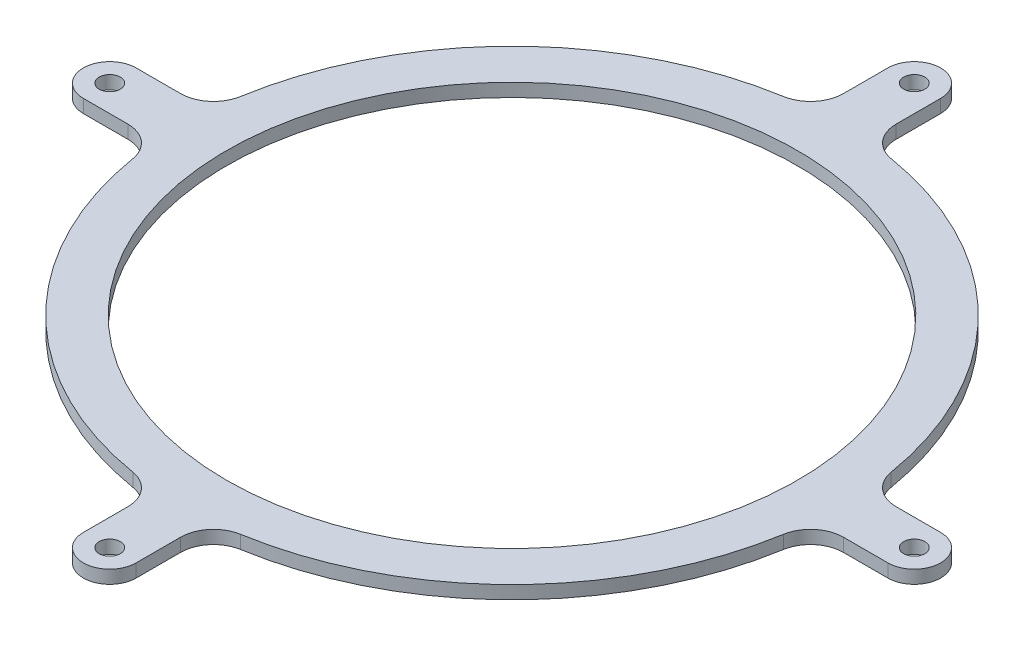
ISO-10303-21;
HEADER;
FILE_DESCRIPTION(('STEP AP214'),'2;1');
FILE_NAME('part.step','',(''),(''),'','','');
FILE_SCHEMA(('AUTOMOTIVE_DESIGN { 1 0 10303 214 1 1 1 1 }'));
ENDSEC;
DATA;
#1=APPLICATION_CONTEXT('core data for automotive mechanical design processes');
#2=APPLICATION_PROTOCOL_DEFINITION('international standard','automotive_design',2000,#1);
#3=PRODUCT_CONTEXT('',#1,'mechanical');
#4=PRODUCT('Part','Part','',(#3));
#5=PRODUCT_RELATED_PRODUCT_CATEGORY('part','',(#4));
#6=PRODUCT_DEFINITION_FORMATION('','',#4);
#7=PRODUCT_DEFINITION_CONTEXT('part definition',#1,'design');
#8=PRODUCT_DEFINITION('design','',#6,#7);
#9=PRODUCT_DEFINITION_SHAPE('','',#8);
#10=(LENGTH_UNIT() NAMED_UNIT(*) SI_UNIT(.MILLI.,.METRE.));
#11=(NAMED_UNIT(*) PLANE_ANGLE_UNIT() SI_UNIT($,.RADIAN.));
#12=(NAMED_UNIT(*) SI_UNIT($,.STERADIAN.) SOLID_ANGLE_UNIT());
#13=UNCERTAINTY_MEASURE_WITH_UNIT(LENGTH_MEASURE(1.E-05),#10,'distance_accuracy_value','');
#14=(GEOMETRIC_REPRESENTATION_CONTEXT(3) GLOBAL_UNCERTAINTY_ASSIGNED_CONTEXT((#13)) GLOBAL_UNIT_ASSIGNED_CONTEXT((#10,
#11,#12)) REPRESENTATION_CONTEXT('',''));
#15=CARTESIAN_POINT('',(0.,0.,0.));
#16=DIRECTION('',(0.,0.,1.));
#17=DIRECTION('',(1.,0.,0.));
#18=AXIS2_PLACEMENT_3D('',#15,#16,#17);
#19=CARTESIAN_POINT('',(0.,2.,0.));
#20=DIRECTION('',(0.,-1.,0.));
#21=DIRECTION('',(0.,0.,-1.));
#22=AXIS2_PLACEMENT_3D('',#19,#20,#21);
#23=CYLINDRICAL_SURFACE('',#22,50.);
#24=CARTESIAN_POINT('',(0.,2.,0.));
#25=DIRECTION('',(0.,1.,0.));
#26=DIRECTION('',(0.,0.,1.));
#27=AXIS2_PLACEMENT_3D('',#24,#25,#26);
#28=CIRCLE('',#27,50.);
#29=CARTESIAN_POINT('',(-8.18181818181824,2.,-49.326036240911));
#30=VERTEX_POINT('',#29);
#31=CARTESIAN_POINT('',(-49.326036240911,2.,-8.18181818181819));
#32=VERTEX_POINT('',#31);
#33=EDGE_CURVE('E368',#30,#32,#28,.T.);
#34=ORIENTED_EDGE('',*,*,#33,.F.);
#35=DIRECTION('',(0.,-1.,0.));
#36=VECTOR('',#35,1.);
#37=CARTESIAN_POINT('',(-8.18181818181824,2.,-49.326036240911));
#38=LINE('',#37,#36);
#39=CARTESIAN_POINT('',(-8.18181818181824,0.,-49.326036240911));
#40=VERTEX_POINT('',#39);
#41=EDGE_CURVE('E404',#30,#40,#38,.T.);
#42=ORIENTED_EDGE('',*,*,#41,.T.);
#43=CARTESIAN_POINT('',(0.,0.,0.));
#44=DIRECTION('',(0.,1.,0.));
#45=DIRECTION('',(0.,0.,1.));
#46=AXIS2_PLACEMENT_3D('',#43,#44,#45);
#47=CIRCLE('',#46,50.);
#48=CARTESIAN_POINT('',(-49.326036240911,0.,-8.18181818181819));
#49=VERTEX_POINT('',#48);
#50=EDGE_CURVE('E374',#40,#49,#47,.T.);
#51=ORIENTED_EDGE('',*,*,#50,.T.);
#52=DIRECTION('',(0.,-1.,0.));
#53=VECTOR('',#52,1.);
#54=CARTESIAN_POINT('',(-49.326036240911,2.,-8.18181818181819));
#55=LINE('',#54,#53);
#56=EDGE_CURVE('E400',#49,#32,#55,.F.);
#57=ORIENTED_EDGE('',*,*,#56,.T.);
#58=EDGE_LOOP('',(#34,#42,#51,#57));
#59=FACE_BOUND('',#58,.T.);
#60=ADVANCED_FACE('F39',(#59),#23,.T.);
#61=CARTESIAN_POINT('',(-49.326036240911,2.,8.18181818181818));
#62=VERTEX_POINT('',#61);
#63=CARTESIAN_POINT('',(-8.18181818181824,2.,49.326036240911));
#64=VERTEX_POINT('',#63);
#65=EDGE_CURVE('E364',#62,#64,#28,.T.);
#66=ORIENTED_EDGE('',*,*,#65,.F.);
#67=DIRECTION('',(0.,-1.,0.));
#68=VECTOR('',#67,1.);
#69=CARTESIAN_POINT('',(-49.326036240911,2.,8.18181818181818));
#70=LINE('',#69,#68);
#71=CARTESIAN_POINT('',(-49.326036240911,0.,8.18181818181818));
#72=VERTEX_POINT('',#71);
#73=EDGE_CURVE('E418',#62,#72,#70,.T.);
#74=ORIENTED_EDGE('',*,*,#73,.T.);
#75=CARTESIAN_POINT('',(-8.18181818181824,0.,49.326036240911));
#76=VERTEX_POINT('',#75);
#77=EDGE_CURVE('E370',#72,#76,#47,.T.);
#78=ORIENTED_EDGE('',*,*,#77,.T.);
#79=DIRECTION('',(0.,-1.,0.));
#80=VECTOR('',#79,1.);
#81=CARTESIAN_POINT('',(-8.18181818181824,2.,49.326036240911));
#82=LINE('',#81,#80);
#83=EDGE_CURVE('E414',#76,#64,#82,.F.);
#84=ORIENTED_EDGE('',*,*,#83,.T.);
#85=EDGE_LOOP('',(#66,#74,#78,#84));
#86=FACE_BOUND('',#85,.T.);
#87=ADVANCED_FACE('F556',(#86),#23,.T.);
#88=CARTESIAN_POINT('',(8.18181818181813,0.,49.3260362409111));
#89=VERTEX_POINT('',#88);
#90=CARTESIAN_POINT('',(49.326036240911,0.,8.18181818181818));
#91=VERTEX_POINT('',#90);
#92=EDGE_CURVE('E360',#89,#91,#47,.T.);
#93=ORIENTED_EDGE('',*,*,#92,.T.);
#94=DIRECTION('',(0.,-1.,0.));
#95=VECTOR('',#94,1.);
#96=CARTESIAN_POINT('',(49.326036240911,2.,8.18181818181818));
#97=LINE('',#96,#95);
#98=CARTESIAN_POINT('',(49.326036240911,2.,8.18181818181818));
#99=VERTEX_POINT('',#98);
#100=EDGE_CURVE('E379',#91,#99,#97,.F.);
#101=ORIENTED_EDGE('',*,*,#100,.T.);
#102=CARTESIAN_POINT('',(8.18181818181813,2.,49.3260362409111));
#103=VERTEX_POINT('',#102);
#104=EDGE_CURVE('E369',#103,#99,#28,.T.);
#105=ORIENTED_EDGE('',*,*,#104,.F.);
#106=DIRECTION('',(0.,-1.,0.));
#107=VECTOR('',#106,1.);
#108=CARTESIAN_POINT('',(8.18181818181813,2.,49.3260362409111));
#109=LINE('',#108,#107);
#110=EDGE_CURVE('E375',#103,#89,#109,.T.);
#111=ORIENTED_EDGE('',*,*,#110,.T.);
#112=EDGE_LOOP('',(#93,#101,#105,#111));
#113=FACE_BOUND('',#112,.T.);
#114=ADVANCED_FACE('F487',(#113),#23,.T.);
#115=CARTESIAN_POINT('',(0.,2.,0.));
#116=DIRECTION('',(0.,1.,0.));
#117=DIRECTION('',(0.,0.,1.));
#118=AXIS2_PLACEMENT_3D('',#115,#116,#117);
#119=PLANE('',#118);
#120=DIRECTION('',(0.,0.,1.));
#121=VECTOR('',#120,1.);
#122=CARTESIAN_POINT('',(-4.00000000000006,2.,-47.6833713481392));
#123=LINE('',#122,#121);
#124=CARTESIAN_POINT('',(-3.99999999999936,2.,-61.0000000000001));
#125=VERTEX_POINT('',#124);
#126=CARTESIAN_POINT('',(-4.00000000000006,2.,-54.2586398650021));
#127=VERTEX_POINT('',#126);
#128=EDGE_CURVE('E213',#125,#127,#123,.T.);
#129=ORIENTED_EDGE('',*,*,#128,.T.);
#130=CARTESIAN_POINT('',(-9.00000000000006,2.,-54.2586398650021));
#131=DIRECTION('',(0.,1.,0.));
#132=DIRECTION('',(0.,0.,1.));
#133=AXIS2_PLACEMENT_3D('',#130,#131,#132);
#134=CIRCLE('',#133,5.);
#135=EDGE_CURVE('E451',#127,#30,#134,.F.);
#136=ORIENTED_EDGE('',*,*,#135,.T.);
#137=ORIENTED_EDGE('',*,*,#33,.T.);
#138=CARTESIAN_POINT('',(-54.2586398650021,2.,-9.00000000000001));
#139=DIRECTION('',(0.,1.,0.));
#140=DIRECTION('',(0.,0.,1.));
#141=AXIS2_PLACEMENT_3D('',#138,#139,#140);
#142=CIRCLE('',#141,5.);
#143=CARTESIAN_POINT('',(-54.2586398650021,2.,-4.00000000000001));
#144=VERTEX_POINT('',#143);
#145=EDGE_CURVE('E454',#32,#144,#142,.F.);
#146=ORIENTED_EDGE('',*,*,#145,.T.);
#147=DIRECTION('',(-1.,0.,0.));
#148=VECTOR('',#147,1.);
#149=CARTESIAN_POINT('',(-61.0000000000001,2.,-4.00000000000001));
#150=LINE('',#149,#148);
#151=CARTESIAN_POINT('',(-61.0000000000001,2.,-4.00000000000001));
#152=VERTEX_POINT('',#151);
#153=EDGE_CURVE('E251',#144,#152,#150,.T.);
#154=ORIENTED_EDGE('',*,*,#153,.T.);
#155=CARTESIAN_POINT('',(-61.,2.,-4.25960723338862E-13));
#156=DIRECTION('',(0.,1.,0.));
#157=DIRECTION('',(0.,0.,-1.));
#158=AXIS2_PLACEMENT_3D('',#155,#156,#157);
#159=CIRCLE('',#158,4.);
#160=CARTESIAN_POINT('',(-61.0000000000001,2.,3.99999999999957));
#161=VERTEX_POINT('',#160);
#162=EDGE_CURVE('E270',#152,#161,#159,.T.);
#163=ORIENTED_EDGE('',*,*,#162,.T.);
#164=DIRECTION('',(1.,0.,0.));
#165=VECTOR('',#164,1.);
#166=CARTESIAN_POINT('',(-47.6833713481393,2.,3.99999999999999));
#167=LINE('',#166,#165);
#168=CARTESIAN_POINT('',(-54.2586398650021,2.,3.99999999999999));
#169=VERTEX_POINT('',#168);
#170=EDGE_CURVE('E259',#161,#169,#167,.T.);
#171=ORIENTED_EDGE('',*,*,#170,.T.);
#172=CARTESIAN_POINT('',(-54.2586398650021,2.,8.99999999999999));
#173=DIRECTION('',(0.,1.,0.));
#174=DIRECTION('',(0.,0.,1.));
#175=AXIS2_PLACEMENT_3D('',#172,#173,#174);
#176=CIRCLE('',#175,5.);
#177=EDGE_CURVE('E463',#169,#62,#176,.F.);
#178=ORIENTED_EDGE('',*,*,#177,.T.);
#179=ORIENTED_EDGE('',*,*,#65,.T.);
#180=CARTESIAN_POINT('',(-9.00000000000006,2.,54.2586398650021));
#181=DIRECTION('',(0.,1.,0.));
#182=DIRECTION('',(0.,0.,1.));
#183=AXIS2_PLACEMENT_3D('',#180,#181,#182);
#184=CIRCLE('',#183,5.);
#185=CARTESIAN_POINT('',(-4.00000000000006,2.,54.2586398650021));
#186=VERTEX_POINT('',#185);
#187=EDGE_CURVE('E466',#64,#186,#184,.F.);
#188=ORIENTED_EDGE('',*,*,#187,.T.);
#189=DIRECTION('',(0.,0.,1.));
#190=VECTOR('',#189,1.);
#191=CARTESIAN_POINT('',(-4.00000000000006,2.,61.));
#192=LINE('',#191,#190);
#193=CARTESIAN_POINT('',(-4.00000000000006,2.,61.));
#194=VERTEX_POINT('',#193);
#195=EDGE_CURVE('E288',#186,#194,#192,.T.);
#196=ORIENTED_EDGE('',*,*,#195,.T.);
#197=CARTESIAN_POINT('',(-2.12980361669431E-13,2.,61.));
#198=DIRECTION('',(0.,1.,0.));
#199=DIRECTION('',(0.,0.,-1.));
#200=AXIS2_PLACEMENT_3D('',#197,#198,#199);
#201=CIRCLE('',#200,4.);
#202=CARTESIAN_POINT('',(3.99999999999979,2.,61.));
#203=VERTEX_POINT('',#202);
#204=EDGE_CURVE('E306',#194,#203,#201,.T.);
#205=ORIENTED_EDGE('',*,*,#204,.T.);
#206=DIRECTION('',(0.,0.,-1.));
#207=VECTOR('',#206,1.);
#208=CARTESIAN_POINT('',(3.99999999999994,2.,47.6833713481392));
#209=LINE('',#208,#207);
#210=CARTESIAN_POINT('',(3.99999999999994,2.,54.2586398650022));
#211=VERTEX_POINT('',#210);
#212=EDGE_CURVE('E296',#203,#211,#209,.T.);
#213=ORIENTED_EDGE('',*,*,#212,.T.);
#214=CARTESIAN_POINT('',(8.99999999999994,2.,54.2586398650022));
#215=DIRECTION('',(0.,1.,0.));
#216=DIRECTION('',(0.,0.,1.));
#217=AXIS2_PLACEMENT_3D('',#214,#215,#216);
#218=CIRCLE('',#217,5.);
#219=EDGE_CURVE('E11',#211,#103,#218,.F.);
#220=ORIENTED_EDGE('',*,*,#219,.T.);
#221=ORIENTED_EDGE('',*,*,#104,.T.);
#222=CARTESIAN_POINT('',(54.2586398650021,2.,9.));
#223=DIRECTION('',(0.,1.,0.));
#224=DIRECTION('',(0.,0.,1.));
#225=AXIS2_PLACEMENT_3D('',#222,#223,#224);
#226=CIRCLE('',#225,5.);
#227=CARTESIAN_POINT('',(54.2586398650021,2.,4.));
#228=VERTEX_POINT('',#227);
#229=EDGE_CURVE('E430',#99,#228,#226,.F.);
#230=ORIENTED_EDGE('',*,*,#229,.T.);
#231=DIRECTION('',(1.,0.,0.));
#232=VECTOR('',#231,1.);
#233=CARTESIAN_POINT('',(61.,2.,4.));
#234=LINE('',#233,#232);
#235=CARTESIAN_POINT('',(61.,2.,4.));
#236=VERTEX_POINT('',#235);
#237=EDGE_CURVE('E323',#228,#236,#234,.T.);
#238=ORIENTED_EDGE('',*,*,#237,.T.);
#239=CARTESIAN_POINT('',(61.,2.,0.));
#240=DIRECTION('',(0.,1.,0.));
#241=DIRECTION('',(0.,0.,-1.));
#242=AXIS2_PLACEMENT_3D('',#239,#240,#241);
#243=CIRCLE('',#242,4.);
#244=CARTESIAN_POINT('',(61.,2.,-4.));
#245=VERTEX_POINT('',#244);
#246=EDGE_CURVE('E342',#236,#245,#243,.T.);
#247=ORIENTED_EDGE('',*,*,#246,.T.);
#248=DIRECTION('',(-1.,0.,0.));
#249=VECTOR('',#248,1.);
#250=CARTESIAN_POINT('',(47.6833713481392,2.,-4.));
#251=LINE('',#250,#249);
#252=CARTESIAN_POINT('',(54.2586398650021,2.,-4.));
#253=VERTEX_POINT('',#252);
#254=EDGE_CURVE('E331',#245,#253,#251,.T.);
#255=ORIENTED_EDGE('',*,*,#254,.T.);
#256=CARTESIAN_POINT('',(54.2586398650021,2.,-9.));
#257=DIRECTION('',(0.,1.,0.));
#258=DIRECTION('',(0.,0.,1.));
#259=AXIS2_PLACEMENT_3D('',#256,#257,#258);
#260=CIRCLE('',#259,5.);
#261=CARTESIAN_POINT('',(49.326036240911,2.,-8.18181818181818));
#262=VERTEX_POINT('',#261);
#263=EDGE_CURVE('E439',#253,#262,#260,.F.);
#264=ORIENTED_EDGE('',*,*,#263,.T.);
#265=CARTESIAN_POINT('',(8.18181818181813,2.,-49.3260362409111));
#266=VERTEX_POINT('',#265);
#267=EDGE_CURVE('E380',#262,#266,#28,.T.);
#268=ORIENTED_EDGE('',*,*,#267,.T.);
#269=CARTESIAN_POINT('',(8.99999999999994,2.,-54.2586398650022));
#270=DIRECTION('',(0.,1.,0.));
#271=DIRECTION('',(0.,0.,1.));
#272=AXIS2_PLACEMENT_3D('',#269,#270,#271);
#273=CIRCLE('',#272,5.);
#274=CARTESIAN_POINT('',(3.99999999999994,2.,-54.2586398650022));
#275=VERTEX_POINT('',#274);
#276=EDGE_CURVE('E442',#266,#275,#273,.F.);
#277=ORIENTED_EDGE('',*,*,#276,.T.);
#278=DIRECTION('',(0.,0.,-1.));
#279=VECTOR('',#278,1.);
#280=CARTESIAN_POINT('',(3.99999999999994,2.,-61.0000000000001));
#281=LINE('',#280,#279);
#282=CARTESIAN_POINT('',(3.99999999999994,2.,-61.0000000000001));
#283=VERTEX_POINT('',#282);
#284=EDGE_CURVE('E235',#275,#283,#281,.T.);
#285=ORIENTED_EDGE('',*,*,#284,.T.);
#286=CARTESIAN_POINT('',(6.38941085008293E-13,2.,-61.));
#287=DIRECTION('',(0.,1.,0.));
#288=DIRECTION('',(0.,0.,-1.));
#289=AXIS2_PLACEMENT_3D('',#286,#287,#288);
#290=CIRCLE('',#289,4.);
#291=EDGE_CURVE('E220',#283,#125,#290,.T.);
#292=ORIENTED_EDGE('',*,*,#291,.T.);
#293=EDGE_LOOP('',(#129,#136,#137,#146,#154,#163,#171,#178,#179,#188,#196,#205,#213,#220,#221,
#230,#238,#247,#255,#264,#268,#277,#285,#292));
#294=FACE_BOUND('',#293,.T.);
#295=CARTESIAN_POINT('',(0.,2.,0.));
#296=DIRECTION('',(0.,1.,0.));
#297=DIRECTION('',(0.,0.,1.));
#298=AXIS2_PLACEMENT_3D('',#295,#296,#297);
#299=CIRCLE('',#298,43.3);
#300=CARTESIAN_POINT('',(0.,2.,43.3));
#301=VERTEX_POINT('',#300);
#302=EDGE_CURVE('E356',#301,#301,#299,.T.);
#303=ORIENTED_EDGE('',*,*,#302,.F.);
#304=EDGE_LOOP('',(#303));
#305=FACE_BOUND('',#304,.T.);
#306=CARTESIAN_POINT('',(61.,2.,0.));
#307=DIRECTION('',(0.,1.,0.));
#308=DIRECTION('',(0.,0.,1.));
#309=AXIS2_PLACEMENT_3D('',#306,#307,#308);
#310=CIRCLE('',#309,1.60000000000001);
#311=CARTESIAN_POINT('',(61.,2.,1.60000000000001));
#312=VERTEX_POINT('',#311);
#313=EDGE_CURVE('E315',#312,#312,#310,.T.);
#314=ORIENTED_EDGE('',*,*,#313,.F.);
#315=EDGE_LOOP('',(#314));
#316=FACE_BOUND('',#315,.T.);
#317=CARTESIAN_POINT('',(-2.12980361669431E-13,2.,61.));
#318=DIRECTION('',(0.,1.,0.));
#319=DIRECTION('',(0.,0.,1.));
#320=AXIS2_PLACEMENT_3D('',#317,#318,#319);
#321=CIRCLE('',#320,1.6);
#322=CARTESIAN_POINT('',(-2.12980361669431E-13,2.,62.6));
#323=VERTEX_POINT('',#322);
#324=EDGE_CURVE('E280',#323,#323,#321,.T.);
#325=ORIENTED_EDGE('',*,*,#324,.F.);
#326=EDGE_LOOP('',(#325));
#327=FACE_BOUND('',#326,.T.);
#328=CARTESIAN_POINT('',(-61.,2.,-4.25960723338862E-13));
#329=DIRECTION('',(0.,1.,0.));
#330=DIRECTION('',(0.,0.,1.));
#331=AXIS2_PLACEMENT_3D('',#328,#329,#330);
#332=CIRCLE('',#331,1.6);
#333=CARTESIAN_POINT('',(-61.,2.,1.59999999999958));
#334=VERTEX_POINT('',#333);
#335=EDGE_CURVE('E245',#334,#334,#332,.T.);
#336=ORIENTED_EDGE('',*,*,#335,.F.);
#337=EDGE_LOOP('',(#336));
#338=FACE_BOUND('',#337,.T.);
#339=CARTESIAN_POINT('',(6.38941085008293E-13,2.,-61.));
#340=DIRECTION('',(0.,1.,0.));
#341=DIRECTION('',(0.,0.,1.));
#342=AXIS2_PLACEMENT_3D('',#339,#340,#341);
#343=CIRCLE('',#342,1.6);
#344=CARTESIAN_POINT('',(6.38941085008293E-13,2.,-59.4));
#345=VERTEX_POINT('',#344);
#346=EDGE_CURVE('E650',#345,#345,#343,.T.);
#347=ORIENTED_EDGE('',*,*,#346,.F.);
#348=EDGE_LOOP('',(#347));
#349=FACE_BOUND('',#348,.T.);
#350=ADVANCED_FACE('F496',(#294,#305,#316,#327,#338,#349),#119,.T.);
#351=CARTESIAN_POINT('',(0.,0.,0.));
#352=DIRECTION('',(0.,1.,0.));
#353=DIRECTION('',(0.,0.,1.));
#354=AXIS2_PLACEMENT_3D('',#351,#352,#353);
#355=PLANE('',#354);
#356=ORIENTED_EDGE('',*,*,#50,.F.);
#357=CARTESIAN_POINT('',(-9.00000000000006,0.,-54.2586398650021));
#358=DIRECTION('',(0.,1.,0.));
#359=DIRECTION('',(0.,0.,1.));
#360=AXIS2_PLACEMENT_3D('',#357,#358,#359);
#361=CIRCLE('',#360,5.);
#362=CARTESIAN_POINT('',(-4.00000000000006,0.,-54.2586398650021));
#363=VERTEX_POINT('',#362);
#364=EDGE_CURVE('E448',#40,#363,#361,.T.);
#365=ORIENTED_EDGE('',*,*,#364,.T.);
#366=DIRECTION('',(0.,0.,1.));
#367=VECTOR('',#366,1.);
#368=CARTESIAN_POINT('',(-4.00000000000006,0.,-47.6833713481392));
#369=LINE('',#368,#367);
#370=CARTESIAN_POINT('',(-3.99999999999936,0.,-61.0000000000001));
#371=VERTEX_POINT('',#370);
#372=EDGE_CURVE('E223',#371,#363,#369,.T.);
#373=ORIENTED_EDGE('',*,*,#372,.F.);
#374=CARTESIAN_POINT('',(6.38941085008293E-13,0.,-61.));
#375=DIRECTION('',(0.,1.,0.));
#376=DIRECTION('',(0.,0.,-1.));
#377=AXIS2_PLACEMENT_3D('',#374,#375,#376);
#378=CIRCLE('',#377,4.);
#379=CARTESIAN_POINT('',(3.99999999999994,0.,-61.0000000000001));
#380=VERTEX_POINT('',#379);
#381=EDGE_CURVE('E212',#380,#371,#378,.T.);
#382=ORIENTED_EDGE('',*,*,#381,.F.);
#383=DIRECTION('',(0.,0.,-1.));
#384=VECTOR('',#383,1.);
#385=CARTESIAN_POINT('',(3.99999999999994,0.,-61.0000000000001));
#386=LINE('',#385,#384);
#387=CARTESIAN_POINT('',(3.99999999999994,0.,-54.2586398650022));
#388=VERTEX_POINT('',#387);
#389=EDGE_CURVE('E201',#388,#380,#386,.T.);
#390=ORIENTED_EDGE('',*,*,#389,.F.);
#391=CARTESIAN_POINT('',(8.99999999999994,0.,-54.2586398650022));
#392=DIRECTION('',(0.,1.,0.));
#393=DIRECTION('',(0.,0.,1.));
#394=AXIS2_PLACEMENT_3D('',#391,#392,#393);
#395=CIRCLE('',#394,5.);
#396=CARTESIAN_POINT('',(8.18181818181813,0.,-49.3260362409111));
#397=VERTEX_POINT('',#396);
#398=EDGE_CURVE('E445',#388,#397,#395,.T.);
#399=ORIENTED_EDGE('',*,*,#398,.T.);
#400=CARTESIAN_POINT('',(49.326036240911,0.,-8.18181818181818));
#401=VERTEX_POINT('',#400);
#402=EDGE_CURVE('E479',#401,#397,#47,.T.);
#403=ORIENTED_EDGE('',*,*,#402,.F.);
#404=CARTESIAN_POINT('',(54.2586398650021,0.,-9.));
#405=DIRECTION('',(0.,1.,0.));
#406=DIRECTION('',(0.,0.,1.));
#407=AXIS2_PLACEMENT_3D('',#404,#405,#406);
#408=CIRCLE('',#407,5.);
#409=CARTESIAN_POINT('',(54.2586398650021,0.,-4.));
#410=VERTEX_POINT('',#409);
#411=EDGE_CURVE('E436',#401,#410,#408,.T.);
#412=ORIENTED_EDGE('',*,*,#411,.T.);
#413=DIRECTION('',(-1.,0.,0.));
#414=VECTOR('',#413,1.);
#415=CARTESIAN_POINT('',(47.6833713481392,0.,-4.));
#416=LINE('',#415,#414);
#417=CARTESIAN_POINT('',(61.,0.,-4.));
#418=VERTEX_POINT('',#417);
#419=EDGE_CURVE('E335',#418,#410,#416,.T.);
#420=ORIENTED_EDGE('',*,*,#419,.F.);
#421=CARTESIAN_POINT('',(61.,0.,0.));
#422=DIRECTION('',(0.,1.,0.));
#423=DIRECTION('',(0.,0.,-1.));
#424=AXIS2_PLACEMENT_3D('',#421,#422,#423);
#425=CIRCLE('',#424,4.);
#426=CARTESIAN_POINT('',(61.,0.,4.));
#427=VERTEX_POINT('',#426);
#428=EDGE_CURVE('E330',#427,#418,#425,.T.);
#429=ORIENTED_EDGE('',*,*,#428,.F.);
#430=DIRECTION('',(1.,0.,0.));
#431=VECTOR('',#430,1.);
#432=CARTESIAN_POINT('',(61.,0.,4.));
#433=LINE('',#432,#431);
#434=CARTESIAN_POINT('',(54.2586398650021,0.,4.));
#435=VERTEX_POINT('',#434);
#436=EDGE_CURVE('E327',#435,#427,#433,.T.);
#437=ORIENTED_EDGE('',*,*,#436,.F.);
#438=CARTESIAN_POINT('',(54.2586398650021,0.,9.));
#439=DIRECTION('',(0.,1.,0.));
#440=DIRECTION('',(0.,0.,1.));
#441=AXIS2_PLACEMENT_3D('',#438,#439,#440);
#442=CIRCLE('',#441,5.);
#443=EDGE_CURVE('E433',#435,#91,#442,.T.);
#444=ORIENTED_EDGE('',*,*,#443,.T.);
#445=ORIENTED_EDGE('',*,*,#92,.F.);
#446=CARTESIAN_POINT('',(8.99999999999994,0.,54.2586398650022));
#447=DIRECTION('',(0.,1.,0.));
#448=DIRECTION('',(0.,0.,1.));
#449=AXIS2_PLACEMENT_3D('',#446,#447,#448);
#450=CIRCLE('',#449,5.);
#451=CARTESIAN_POINT('',(3.99999999999994,0.,54.2586398650022));
#452=VERTEX_POINT('',#451);
#453=EDGE_CURVE('E48',#89,#452,#450,.T.);
#454=ORIENTED_EDGE('',*,*,#453,.T.);
#455=DIRECTION('',(0.,0.,-1.));
#456=VECTOR('',#455,1.);
#457=CARTESIAN_POINT('',(3.99999999999994,0.,47.6833713481392));
#458=LINE('',#457,#456);
#459=CARTESIAN_POINT('',(3.99999999999979,0.,61.));
#460=VERTEX_POINT('',#459);
#461=EDGE_CURVE('E300',#460,#452,#458,.T.);
#462=ORIENTED_EDGE('',*,*,#461,.F.);
#463=CARTESIAN_POINT('',(-2.12980361669431E-13,0.,61.));
#464=DIRECTION('',(0.,1.,0.));
#465=DIRECTION('',(0.,0.,-1.));
#466=AXIS2_PLACEMENT_3D('',#463,#464,#465);
#467=CIRCLE('',#466,4.);
#468=CARTESIAN_POINT('',(-4.00000000000006,0.,61.));
#469=VERTEX_POINT('',#468);
#470=EDGE_CURVE('E295',#469,#460,#467,.T.);
#471=ORIENTED_EDGE('',*,*,#470,.F.);
#472=DIRECTION('',(0.,0.,1.));
#473=VECTOR('',#472,1.);
#474=CARTESIAN_POINT('',(-4.00000000000006,0.,61.));
#475=LINE('',#474,#473);
#476=CARTESIAN_POINT('',(-4.00000000000006,0.,54.2586398650021));
#477=VERTEX_POINT('',#476);
#478=EDGE_CURVE('E292',#477,#469,#475,.T.);
#479=ORIENTED_EDGE('',*,*,#478,.F.);
#480=CARTESIAN_POINT('',(-9.00000000000006,0.,54.2586398650021));
#481=DIRECTION('',(0.,1.,0.));
#482=DIRECTION('',(0.,0.,1.));
#483=AXIS2_PLACEMENT_3D('',#480,#481,#482);
#484=CIRCLE('',#483,5.);
#485=EDGE_CURVE('E469',#477,#76,#484,.T.);
#486=ORIENTED_EDGE('',*,*,#485,.T.);
#487=ORIENTED_EDGE('',*,*,#77,.F.);
#488=CARTESIAN_POINT('',(-54.2586398650021,0.,8.99999999999999));
#489=DIRECTION('',(0.,1.,0.));
#490=DIRECTION('',(0.,0.,1.));
#491=AXIS2_PLACEMENT_3D('',#488,#489,#490);
#492=CIRCLE('',#491,5.);
#493=CARTESIAN_POINT('',(-54.2586398650021,0.,3.99999999999999));
#494=VERTEX_POINT('',#493);
#495=EDGE_CURVE('E460',#72,#494,#492,.T.);
#496=ORIENTED_EDGE('',*,*,#495,.T.);
#497=DIRECTION('',(1.,0.,0.));
#498=VECTOR('',#497,1.);
#499=CARTESIAN_POINT('',(-47.6833713481393,0.,3.99999999999999));
#500=LINE('',#499,#498);
#501=CARTESIAN_POINT('',(-61.0000000000001,0.,3.99999999999957));
#502=VERTEX_POINT('',#501);
#503=EDGE_CURVE('E263',#502,#494,#500,.T.);
#504=ORIENTED_EDGE('',*,*,#503,.F.);
#505=CARTESIAN_POINT('',(-61.,0.,-4.25960723338862E-13));
#506=DIRECTION('',(0.,1.,0.));
#507=DIRECTION('',(0.,0.,-1.));
#508=AXIS2_PLACEMENT_3D('',#505,#506,#507);
#509=CIRCLE('',#508,4.);
#510=CARTESIAN_POINT('',(-61.0000000000001,0.,-4.00000000000001));
#511=VERTEX_POINT('',#510);
#512=EDGE_CURVE('E258',#511,#502,#509,.T.);
#513=ORIENTED_EDGE('',*,*,#512,.F.);
#514=DIRECTION('',(-1.,0.,0.));
#515=VECTOR('',#514,1.);
#516=CARTESIAN_POINT('',(-61.0000000000001,0.,-4.00000000000001));
#517=LINE('',#516,#515);
#518=CARTESIAN_POINT('',(-54.2586398650021,0.,-4.00000000000001));
#519=VERTEX_POINT('',#518);
#520=EDGE_CURVE('E255',#519,#511,#517,.T.);
#521=ORIENTED_EDGE('',*,*,#520,.F.);
#522=CARTESIAN_POINT('',(-54.2586398650021,0.,-9.00000000000001));
#523=DIRECTION('',(0.,1.,0.));
#524=DIRECTION('',(0.,0.,1.));
#525=AXIS2_PLACEMENT_3D('',#522,#523,#524);
#526=CIRCLE('',#525,5.);
#527=EDGE_CURVE('E457',#519,#49,#526,.T.);
#528=ORIENTED_EDGE('',*,*,#527,.T.);
#529=EDGE_LOOP('',(#356,#365,#373,#382,#390,#399,#403,#412,#420,#429,#437,#444,#445,#454,#462,
#471,#479,#486,#487,#496,#504,#513,#521,#528));
#530=FACE_BOUND('',#529,.T.);
#531=CARTESIAN_POINT('',(0.,0.,0.));
#532=DIRECTION('',(0.,1.,0.));
#533=DIRECTION('',(0.,0.,1.));
#534=AXIS2_PLACEMENT_3D('',#531,#532,#533);
#535=CIRCLE('',#534,43.3);
#536=CARTESIAN_POINT('',(0.,0.,43.3));
#537=VERTEX_POINT('',#536);
#538=EDGE_CURVE('E352',#537,#537,#535,.T.);
#539=ORIENTED_EDGE('',*,*,#538,.T.);
#540=EDGE_LOOP('',(#539));
#541=FACE_BOUND('',#540,.T.);
#542=CARTESIAN_POINT('',(61.,0.,0.));
#543=DIRECTION('',(0.,1.,0.));
#544=DIRECTION('',(0.,0.,1.));
#545=AXIS2_PLACEMENT_3D('',#542,#543,#544);
#546=CIRCLE('',#545,1.60000000000001);
#547=CARTESIAN_POINT('',(61.,0.,1.60000000000001));
#548=VERTEX_POINT('',#547);
#549=EDGE_CURVE('E319',#548,#548,#546,.T.);
#550=ORIENTED_EDGE('',*,*,#549,.T.);
#551=EDGE_LOOP('',(#550));
#552=FACE_BOUND('',#551,.T.);
#553=CARTESIAN_POINT('',(-2.12980361669431E-13,0.,61.));
#554=DIRECTION('',(0.,1.,0.));
#555=DIRECTION('',(0.,0.,1.));
#556=AXIS2_PLACEMENT_3D('',#553,#554,#555);
#557=CIRCLE('',#556,1.6);
#558=CARTESIAN_POINT('',(-2.12980361669431E-13,0.,62.6));
#559=VERTEX_POINT('',#558);
#560=EDGE_CURVE('E284',#559,#559,#557,.T.);
#561=ORIENTED_EDGE('',*,*,#560,.T.);
#562=EDGE_LOOP('',(#561));
#563=FACE_BOUND('',#562,.T.);
#564=CARTESIAN_POINT('',(-61.,0.,-4.25960723338862E-13));
#565=DIRECTION('',(0.,1.,0.));
#566=DIRECTION('',(0.,0.,1.));
#567=AXIS2_PLACEMENT_3D('',#564,#565,#566);
#568=CIRCLE('',#567,1.6);
#569=CARTESIAN_POINT('',(-61.,0.,1.59999999999958));
#570=VERTEX_POINT('',#569);
#571=EDGE_CURVE('E247',#570,#570,#568,.T.);
#572=ORIENTED_EDGE('',*,*,#571,.T.);
#573=EDGE_LOOP('',(#572));
#574=FACE_BOUND('',#573,.T.);
#575=CARTESIAN_POINT('',(6.38941085008293E-13,0.,-61.));
#576=DIRECTION('',(0.,1.,0.));
#577=DIRECTION('',(0.,0.,1.));
#578=AXIS2_PLACEMENT_3D('',#575,#576,#577);
#579=CIRCLE('',#578,1.6);
#580=CARTESIAN_POINT('',(6.38941085008293E-13,0.,-59.4));
#581=VERTEX_POINT('',#580);
#582=EDGE_CURVE('E238',#581,#581,#579,.T.);
#583=ORIENTED_EDGE('',*,*,#582,.T.);
#584=EDGE_LOOP('',(#583));
#585=FACE_BOUND('',#584,.T.);
#586=ADVANCED_FACE('F226',(#530,#541,#552,#563,#574,#585),#355,.F.);
#587=ORIENTED_EDGE('',*,*,#267,.F.);
#588=DIRECTION('',(0.,-1.,0.));
#589=VECTOR('',#588,1.);
#590=CARTESIAN_POINT('',(49.326036240911,2.,-8.18181818181818));
#591=LINE('',#590,#589);
#592=EDGE_CURVE('E391',#262,#401,#591,.T.);
#593=ORIENTED_EDGE('',*,*,#592,.T.);
#594=ORIENTED_EDGE('',*,*,#402,.T.);
#595=DIRECTION('',(0.,-1.,0.));
#596=VECTOR('',#595,1.);
#597=CARTESIAN_POINT('',(8.18181818181813,2.,-49.3260362409111));
#598=LINE('',#597,#596);
#599=EDGE_CURVE('E387',#397,#266,#598,.F.);
#600=ORIENTED_EDGE('',*,*,#599,.T.);
#601=EDGE_LOOP('',(#587,#593,#594,#600));
#602=FACE_BOUND('',#601,.T.);
#603=ADVANCED_FACE('F516',(#602),#23,.T.);
#604=CARTESIAN_POINT('',(0.,2.,0.));
#605=DIRECTION('',(0.,-1.,0.));
#606=DIRECTION('',(0.,0.,-1.));
#607=AXIS2_PLACEMENT_3D('',#604,#605,#606);
#608=CYLINDRICAL_SURFACE('',#607,43.3);
#609=ORIENTED_EDGE('',*,*,#302,.T.);
#610=EDGE_LOOP('',(#609));
#611=FACE_BOUND('',#610,.T.);
#612=ORIENTED_EDGE('',*,*,#538,.F.);
#613=EDGE_LOOP('',(#612));
#614=FACE_BOUND('',#613,.T.);
#615=ADVANCED_FACE('F587',(#611,#614),#608,.F.);
#616=CARTESIAN_POINT('',(61.,0.,4.));
#617=DIRECTION('',(0.,0.,1.));
#618=DIRECTION('',(1.,0.,0.));
#619=AXIS2_PLACEMENT_3D('',#616,#617,#618);
#620=PLANE('',#619);
#621=ORIENTED_EDGE('',*,*,#237,.F.);
#622=DIRECTION('',(0.,-1.,0.));
#623=VECTOR('',#622,1.);
#624=CARTESIAN_POINT('',(54.2586398650021,0.,4.));
#625=LINE('',#624,#623);
#626=EDGE_CURVE('E384',#228,#435,#625,.T.);
#627=ORIENTED_EDGE('',*,*,#626,.T.);
#628=ORIENTED_EDGE('',*,*,#436,.T.);
#629=DIRECTION('',(0.,1.,0.));
#630=VECTOR('',#629,1.);
#631=CARTESIAN_POINT('',(61.,0.,4.));
#632=LINE('',#631,#630);
#633=EDGE_CURVE('E339',#427,#236,#632,.T.);
#634=ORIENTED_EDGE('',*,*,#633,.T.);
#635=EDGE_LOOP('',(#621,#627,#628,#634));
#636=FACE_BOUND('',#635,.T.);
#637=ADVANCED_FACE('F499',(#636),#620,.T.);
#638=CARTESIAN_POINT('',(47.6833713481392,0.,-4.));
#639=DIRECTION('',(0.,0.,-1.));
#640=DIRECTION('',(-1.,0.,0.));
#641=AXIS2_PLACEMENT_3D('',#638,#639,#640);
#642=PLANE('',#641);
#643=ORIENTED_EDGE('',*,*,#419,.T.);
#644=DIRECTION('',(0.,-1.,0.));
#645=VECTOR('',#644,1.);
#646=CARTESIAN_POINT('',(54.2586398650021,0.,-4.));
#647=LINE('',#646,#645);
#648=EDGE_CURVE('E395',#410,#253,#647,.F.);
#649=ORIENTED_EDGE('',*,*,#648,.T.);
#650=ORIENTED_EDGE('',*,*,#254,.F.);
#651=DIRECTION('',(0.,1.,0.));
#652=VECTOR('',#651,1.);
#653=CARTESIAN_POINT('',(61.,0.,-4.));
#654=LINE('',#653,#652);
#655=EDGE_CURVE('E349',#418,#245,#654,.T.);
#656=ORIENTED_EDGE('',*,*,#655,.F.);
#657=EDGE_LOOP('',(#643,#649,#650,#656));
#658=FACE_BOUND('',#657,.T.);
#659=ADVANCED_FACE('F604',(#658),#642,.T.);
#660=CARTESIAN_POINT('',(61.,0.,0.));
#661=DIRECTION('',(0.,1.,0.));
#662=DIRECTION('',(0.,0.,1.));
#663=AXIS2_PLACEMENT_3D('',#660,#661,#662);
#664=CYLINDRICAL_SURFACE('',#663,4.);
#665=ORIENTED_EDGE('',*,*,#246,.F.);
#666=ORIENTED_EDGE('',*,*,#633,.F.);
#667=ORIENTED_EDGE('',*,*,#428,.T.);
#668=ORIENTED_EDGE('',*,*,#655,.T.);
#669=EDGE_LOOP('',(#665,#666,#667,#668));
#670=FACE_BOUND('',#669,.T.);
#671=ADVANCED_FACE('F505',(#670),#664,.T.);
#672=CARTESIAN_POINT('',(61.,0.,0.));
#673=DIRECTION('',(0.,1.,0.));
#674=DIRECTION('',(0.,0.,1.));
#675=AXIS2_PLACEMENT_3D('',#672,#673,#674);
#676=CYLINDRICAL_SURFACE('',#675,1.60000000000001);
#677=ORIENTED_EDGE('',*,*,#549,.F.);
#678=EDGE_LOOP('',(#677));
#679=FACE_BOUND('',#678,.T.);
#680=ORIENTED_EDGE('',*,*,#313,.T.);
#681=EDGE_LOOP('',(#680));
#682=FACE_BOUND('',#681,.T.);
#683=ADVANCED_FACE('F607',(#679,#682),#676,.F.);
#684=CARTESIAN_POINT('',(3.99999999999994,0.,47.6833713481392));
#685=DIRECTION('',(1.,0.,0.));
#686=DIRECTION('',(0.,0.,-1.));
#687=AXIS2_PLACEMENT_3D('',#684,#685,#686);
#688=PLANE('',#687);
#689=ORIENTED_EDGE('',*,*,#461,.T.);
#690=DIRECTION('',(0.,-1.,0.));
#691=VECTOR('',#690,1.);
#692=CARTESIAN_POINT('',(3.99999999999994,0.,54.2586398650022));
#693=LINE('',#692,#691);
#694=EDGE_CURVE('E61',#452,#211,#693,.F.);
#695=ORIENTED_EDGE('',*,*,#694,.T.);
#696=ORIENTED_EDGE('',*,*,#212,.F.);
#697=DIRECTION('',(0.,1.,0.));
#698=VECTOR('',#697,1.);
#699=CARTESIAN_POINT('',(3.99999999999979,0.,61.));
#700=LINE('',#699,#698);
#701=EDGE_CURVE('E312',#460,#203,#700,.T.);
#702=ORIENTED_EDGE('',*,*,#701,.F.);
#703=EDGE_LOOP('',(#689,#695,#696,#702));
#704=FACE_BOUND('',#703,.T.);
#705=ADVANCED_FACE('F573',(#704),#688,.T.);
#706=CARTESIAN_POINT('',(-4.00000000000006,0.,61.));
#707=DIRECTION('',(-1.,0.,0.));
#708=DIRECTION('',(0.,0.,1.));
#709=AXIS2_PLACEMENT_3D('',#706,#707,#708);
#710=PLANE('',#709);
#711=ORIENTED_EDGE('',*,*,#195,.F.);
#712=DIRECTION('',(0.,-1.,0.));
#713=VECTOR('',#712,1.);
#714=CARTESIAN_POINT('',(-4.00000000000006,0.,54.2586398650021));
#715=LINE('',#714,#713);
#716=EDGE_CURVE('E425',#186,#477,#715,.T.);
#717=ORIENTED_EDGE('',*,*,#716,.T.);
#718=ORIENTED_EDGE('',*,*,#478,.T.);
#719=DIRECTION('',(0.,1.,0.));
#720=VECTOR('',#719,1.);
#721=CARTESIAN_POINT('',(-4.00000000000006,0.,61.));
#722=LINE('',#721,#720);
#723=EDGE_CURVE('E303',#469,#194,#722,.T.);
#724=ORIENTED_EDGE('',*,*,#723,.T.);
#725=EDGE_LOOP('',(#711,#717,#718,#724));
#726=FACE_BOUND('',#725,.T.);
#727=ADVANCED_FACE('F565',(#726),#710,.T.);
#728=CARTESIAN_POINT('',(-2.12980361669431E-13,0.,61.));
#729=DIRECTION('',(0.,1.,0.));
#730=DIRECTION('',(0.,0.,1.));
#731=AXIS2_PLACEMENT_3D('',#728,#729,#730);
#732=CYLINDRICAL_SURFACE('',#731,4.);
#733=ORIENTED_EDGE('',*,*,#204,.F.);
#734=ORIENTED_EDGE('',*,*,#723,.F.);
#735=ORIENTED_EDGE('',*,*,#470,.T.);
#736=ORIENTED_EDGE('',*,*,#701,.T.);
#737=EDGE_LOOP('',(#733,#734,#735,#736));
#738=FACE_BOUND('',#737,.T.);
#739=ADVANCED_FACE('F571',(#738),#732,.T.);
#740=CARTESIAN_POINT('',(-2.12980361669431E-13,0.,61.));
#741=DIRECTION('',(0.,1.,0.));
#742=DIRECTION('',(0.,0.,1.));
#743=AXIS2_PLACEMENT_3D('',#740,#741,#742);
#744=CYLINDRICAL_SURFACE('',#743,1.6);
#745=ORIENTED_EDGE('',*,*,#560,.F.);
#746=EDGE_LOOP('',(#745));
#747=FACE_BOUND('',#746,.T.);
#748=ORIENTED_EDGE('',*,*,#324,.T.);
#749=EDGE_LOOP('',(#748));
#750=FACE_BOUND('',#749,.T.);
#751=ADVANCED_FACE('F617',(#747,#750),#744,.F.);
#752=CARTESIAN_POINT('',(-47.6833713481393,0.,3.99999999999999));
#753=DIRECTION('',(0.,0.,1.));
#754=DIRECTION('',(1.,0.,0.));
#755=AXIS2_PLACEMENT_3D('',#752,#753,#754);
#756=PLANE('',#755);
#757=ORIENTED_EDGE('',*,*,#503,.T.);
#758=DIRECTION('',(0.,-1.,0.));
#759=VECTOR('',#758,1.);
#760=CARTESIAN_POINT('',(-54.2586398650021,0.,3.99999999999999));
#761=LINE('',#760,#759);
#762=EDGE_CURVE('E422',#494,#169,#761,.F.);
#763=ORIENTED_EDGE('',*,*,#762,.T.);
#764=ORIENTED_EDGE('',*,*,#170,.F.);
#765=DIRECTION('',(0.,1.,0.));
#766=VECTOR('',#765,1.);
#767=CARTESIAN_POINT('',(-61.0000000000001,0.,3.99999999999957));
#768=LINE('',#767,#766);
#769=EDGE_CURVE('E277',#502,#161,#768,.T.);
#770=ORIENTED_EDGE('',*,*,#769,.F.);
#771=EDGE_LOOP('',(#757,#763,#764,#770));
#772=FACE_BOUND('',#771,.T.);
#773=ADVANCED_FACE('F548',(#772),#756,.T.);
#774=CARTESIAN_POINT('',(-61.0000000000001,0.,-4.00000000000001));
#775=DIRECTION('',(0.,0.,-1.));
#776=DIRECTION('',(-1.,0.,0.));
#777=AXIS2_PLACEMENT_3D('',#774,#775,#776);
#778=PLANE('',#777);
#779=ORIENTED_EDGE('',*,*,#153,.F.);
#780=DIRECTION('',(0.,-1.,0.));
#781=VECTOR('',#780,1.);
#782=CARTESIAN_POINT('',(-54.2586398650021,0.,-4.00000000000001));
#783=LINE('',#782,#781);
#784=EDGE_CURVE('E411',#144,#519,#783,.T.);
#785=ORIENTED_EDGE('',*,*,#784,.T.);
#786=ORIENTED_EDGE('',*,*,#520,.T.);
#787=DIRECTION('',(0.,1.,0.));
#788=VECTOR('',#787,1.);
#789=CARTESIAN_POINT('',(-61.0000000000001,0.,-4.00000000000001));
#790=LINE('',#789,#788);
#791=EDGE_CURVE('E267',#511,#152,#790,.T.);
#792=ORIENTED_EDGE('',*,*,#791,.T.);
#793=EDGE_LOOP('',(#779,#785,#786,#792));
#794=FACE_BOUND('',#793,.T.);
#795=ADVANCED_FACE('F538',(#794),#778,.T.);
#796=CARTESIAN_POINT('',(-61.,0.,-4.25960723338862E-13));
#797=DIRECTION('',(0.,1.,0.));
#798=DIRECTION('',(0.,0.,1.));
#799=AXIS2_PLACEMENT_3D('',#796,#797,#798);
#800=CYLINDRICAL_SURFACE('',#799,4.);
#801=ORIENTED_EDGE('',*,*,#162,.F.);
#802=ORIENTED_EDGE('',*,*,#791,.F.);
#803=ORIENTED_EDGE('',*,*,#512,.T.);
#804=ORIENTED_EDGE('',*,*,#769,.T.);
#805=EDGE_LOOP('',(#801,#802,#803,#804));
#806=FACE_BOUND('',#805,.T.);
#807=ADVANCED_FACE('F544',(#806),#800,.T.);
#808=CARTESIAN_POINT('',(-61.,0.,-4.25960723338862E-13));
#809=DIRECTION('',(0.,1.,0.));
#810=DIRECTION('',(0.,0.,1.));
#811=AXIS2_PLACEMENT_3D('',#808,#809,#810);
#812=CYLINDRICAL_SURFACE('',#811,1.6);
#813=ORIENTED_EDGE('',*,*,#571,.F.);
#814=EDGE_LOOP('',(#813));
#815=FACE_BOUND('',#814,.T.);
#816=ORIENTED_EDGE('',*,*,#335,.T.);
#817=EDGE_LOOP('',(#816));
#818=FACE_BOUND('',#817,.T.);
#819=ADVANCED_FACE('F627',(#815,#818),#812,.F.);
#820=CARTESIAN_POINT('',(-4.00000000000006,0.,-47.6833713481392));
#821=DIRECTION('',(-1.,0.,0.));
#822=DIRECTION('',(0.,0.,1.));
#823=AXIS2_PLACEMENT_3D('',#820,#821,#822);
#824=PLANE('',#823);
#825=ORIENTED_EDGE('',*,*,#372,.T.);
#826=DIRECTION('',(0.,-1.,0.));
#827=VECTOR('',#826,1.);
#828=CARTESIAN_POINT('',(-4.00000000000006,0.,-54.2586398650021));
#829=LINE('',#828,#827);
#830=EDGE_CURVE('E408',#363,#127,#829,.F.);
#831=ORIENTED_EDGE('',*,*,#830,.T.);
#832=ORIENTED_EDGE('',*,*,#128,.F.);
#833=DIRECTION('',(0.,1.,0.));
#834=VECTOR('',#833,1.);
#835=CARTESIAN_POINT('',(-3.99999999999936,0.,-61.0000000000001));
#836=LINE('',#835,#834);
#837=EDGE_CURVE('E222',#371,#125,#836,.T.);
#838=ORIENTED_EDGE('',*,*,#837,.F.);
#839=EDGE_LOOP('',(#825,#831,#832,#838));
#840=FACE_BOUND('',#839,.T.);
#841=ADVANCED_FACE('F524',(#840),#824,.T.);
#842=CARTESIAN_POINT('',(3.99999999999994,0.,-61.0000000000001));
#843=DIRECTION('',(1.,0.,0.));
#844=DIRECTION('',(0.,0.,-1.));
#845=AXIS2_PLACEMENT_3D('',#842,#843,#844);
#846=PLANE('',#845);
#847=ORIENTED_EDGE('',*,*,#284,.F.);
#848=DIRECTION('',(0.,-1.,0.));
#849=VECTOR('',#848,1.);
#850=CARTESIAN_POINT('',(3.99999999999994,0.,-54.2586398650022));
#851=LINE('',#850,#849);
#852=EDGE_CURVE('E208',#275,#388,#851,.T.);
#853=ORIENTED_EDGE('',*,*,#852,.T.);
#854=ORIENTED_EDGE('',*,*,#389,.T.);
#855=DIRECTION('',(0.,1.,0.));
#856=VECTOR('',#855,1.);
#857=CARTESIAN_POINT('',(3.99999999999994,0.,-61.0000000000001));
#858=LINE('',#857,#856);
#859=EDGE_CURVE('E205',#380,#283,#858,.T.);
#860=ORIENTED_EDGE('',*,*,#859,.T.);
#861=EDGE_LOOP('',(#847,#853,#854,#860));
#862=FACE_BOUND('',#861,.T.);
#863=ADVANCED_FACE('F204',(#862),#846,.T.);
#864=CARTESIAN_POINT('',(6.38941085008293E-13,0.,-61.));
#865=DIRECTION('',(0.,1.,0.));
#866=DIRECTION('',(0.,0.,1.));
#867=AXIS2_PLACEMENT_3D('',#864,#865,#866);
#868=CYLINDRICAL_SURFACE('',#867,4.);
#869=ORIENTED_EDGE('',*,*,#291,.F.);
#870=ORIENTED_EDGE('',*,*,#859,.F.);
#871=ORIENTED_EDGE('',*,*,#381,.T.);
#872=ORIENTED_EDGE('',*,*,#837,.T.);
#873=EDGE_LOOP('',(#869,#870,#871,#872));
#874=FACE_BOUND('',#873,.T.);
#875=ADVANCED_FACE('F217',(#874),#868,.T.);
#876=CARTESIAN_POINT('',(6.38941085008293E-13,0.,-61.));
#877=DIRECTION('',(0.,1.,0.));
#878=DIRECTION('',(0.,0.,1.));
#879=AXIS2_PLACEMENT_3D('',#876,#877,#878);
#880=CYLINDRICAL_SURFACE('',#879,1.6);
#881=ORIENTED_EDGE('',*,*,#582,.F.);
#882=EDGE_LOOP('',(#881));
#883=FACE_BOUND('',#882,.T.);
#884=ORIENTED_EDGE('',*,*,#346,.T.);
#885=EDGE_LOOP('',(#884));
#886=FACE_BOUND('',#885,.T.);
#887=ADVANCED_FACE('F637',(#883,#886),#880,.F.);
#888=CARTESIAN_POINT('',(54.2586398650021,2.,9.));
#889=DIRECTION('',(0.,-1.,0.));
#890=DIRECTION('',(0.,0.,-1.));
#891=AXIS2_PLACEMENT_3D('',#888,#889,#890);
#892=CYLINDRICAL_SURFACE('',#891,5.);
#893=ORIENTED_EDGE('',*,*,#443,.F.);
#894=ORIENTED_EDGE('',*,*,#626,.F.);
#895=ORIENTED_EDGE('',*,*,#229,.F.);
#896=ORIENTED_EDGE('',*,*,#100,.F.);
#897=EDGE_LOOP('',(#893,#894,#895,#896));
#898=FACE_BOUND('',#897,.T.);
#899=ADVANCED_FACE('F492',(#898),#892,.F.);
#900=CARTESIAN_POINT('',(54.2586398650021,2.,-9.));
#901=DIRECTION('',(0.,-1.,0.));
#902=DIRECTION('',(0.,0.,-1.));
#903=AXIS2_PLACEMENT_3D('',#900,#901,#902);
#904=CYLINDRICAL_SURFACE('',#903,5.);
#905=ORIENTED_EDGE('',*,*,#263,.F.);
#906=ORIENTED_EDGE('',*,*,#648,.F.);
#907=ORIENTED_EDGE('',*,*,#411,.F.);
#908=ORIENTED_EDGE('',*,*,#592,.F.);
#909=EDGE_LOOP('',(#905,#906,#907,#908));
#910=FACE_BOUND('',#909,.T.);
#911=ADVANCED_FACE('F513',(#910),#904,.F.);
#912=CARTESIAN_POINT('',(8.99999999999994,2.,-54.2586398650022));
#913=DIRECTION('',(0.,-1.,0.));
#914=DIRECTION('',(0.,0.,-1.));
#915=AXIS2_PLACEMENT_3D('',#912,#913,#914);
#916=CYLINDRICAL_SURFACE('',#915,5.);
#917=ORIENTED_EDGE('',*,*,#398,.F.);
#918=ORIENTED_EDGE('',*,*,#852,.F.);
#919=ORIENTED_EDGE('',*,*,#276,.F.);
#920=ORIENTED_EDGE('',*,*,#599,.F.);
#921=EDGE_LOOP('',(#917,#918,#919,#920));
#922=FACE_BOUND('',#921,.T.);
#923=ADVANCED_FACE('F520',(#922),#916,.F.);
#924=CARTESIAN_POINT('',(-9.00000000000006,2.,-54.2586398650021));
#925=DIRECTION('',(0.,-1.,0.));
#926=DIRECTION('',(0.,0.,-1.));
#927=AXIS2_PLACEMENT_3D('',#924,#925,#926);
#928=CYLINDRICAL_SURFACE('',#927,5.);
#929=ORIENTED_EDGE('',*,*,#135,.F.);
#930=ORIENTED_EDGE('',*,*,#830,.F.);
#931=ORIENTED_EDGE('',*,*,#364,.F.);
#932=ORIENTED_EDGE('',*,*,#41,.F.);
#933=EDGE_LOOP('',(#929,#930,#931,#932));
#934=FACE_BOUND('',#933,.T.);
#935=ADVANCED_FACE('F527',(#934),#928,.F.);
#936=CARTESIAN_POINT('',(-54.2586398650021,2.,-9.00000000000001));
#937=DIRECTION('',(0.,-1.,0.));
#938=DIRECTION('',(0.,0.,-1.));
#939=AXIS2_PLACEMENT_3D('',#936,#937,#938);
#940=CYLINDRICAL_SURFACE('',#939,5.);
#941=ORIENTED_EDGE('',*,*,#527,.F.);
#942=ORIENTED_EDGE('',*,*,#784,.F.);
#943=ORIENTED_EDGE('',*,*,#145,.F.);
#944=ORIENTED_EDGE('',*,*,#56,.F.);
#945=EDGE_LOOP('',(#941,#942,#943,#944));
#946=FACE_BOUND('',#945,.T.);
#947=ADVANCED_FACE('F534',(#946),#940,.F.);
#948=CARTESIAN_POINT('',(-54.2586398650021,2.,8.99999999999999));
#949=DIRECTION('',(0.,-1.,0.));
#950=DIRECTION('',(0.,0.,-1.));
#951=AXIS2_PLACEMENT_3D('',#948,#949,#950);
#952=CYLINDRICAL_SURFACE('',#951,5.);
#953=ORIENTED_EDGE('',*,*,#177,.F.);
#954=ORIENTED_EDGE('',*,*,#762,.F.);
#955=ORIENTED_EDGE('',*,*,#495,.F.);
#956=ORIENTED_EDGE('',*,*,#73,.F.);
#957=EDGE_LOOP('',(#953,#954,#955,#956));
#958=FACE_BOUND('',#957,.T.);
#959=ADVANCED_FACE('F552',(#958),#952,.F.);
#960=CARTESIAN_POINT('',(-9.00000000000006,2.,54.2586398650021));
#961=DIRECTION('',(0.,-1.,0.));
#962=DIRECTION('',(0.,0.,-1.));
#963=AXIS2_PLACEMENT_3D('',#960,#961,#962);
#964=CYLINDRICAL_SURFACE('',#963,5.);
#965=ORIENTED_EDGE('',*,*,#485,.F.);
#966=ORIENTED_EDGE('',*,*,#716,.F.);
#967=ORIENTED_EDGE('',*,*,#187,.F.);
#968=ORIENTED_EDGE('',*,*,#83,.F.);
#969=EDGE_LOOP('',(#965,#966,#967,#968));
#970=FACE_BOUND('',#969,.T.);
#971=ADVANCED_FACE('F561',(#970),#964,.F.);
#972=CARTESIAN_POINT('',(8.99999999999994,2.,54.2586398650022));
#973=DIRECTION('',(0.,-1.,0.));
#974=DIRECTION('',(0.,0.,-1.));
#975=AXIS2_PLACEMENT_3D('',#972,#973,#974);
#976=CYLINDRICAL_SURFACE('',#975,5.);
#977=ORIENTED_EDGE('',*,*,#219,.F.);
#978=ORIENTED_EDGE('',*,*,#694,.F.);
#979=ORIENTED_EDGE('',*,*,#453,.F.);
#980=ORIENTED_EDGE('',*,*,#110,.F.);
#981=EDGE_LOOP('',(#977,#978,#979,#980));
#982=FACE_BOUND('',#981,.T.);
#983=ADVANCED_FACE('F41',(#982),#976,.F.);
#984=CLOSED_SHELL('',(#60,#87,#114,#350,#586,#603,#615,#637,#659,#671,#683,#705,#727,#739,#751,
#773,#795,#807,#819,#841,#863,#875,#887,#899,#911,#923,#935,#947,#959,#971,#983));
#985=MANIFOLD_SOLID_BREP('B2',#984);
#986=ADVANCED_BREP_SHAPE_REPRESENTATION('',(#18,#985),#14);
#987=SHAPE_DEFINITION_REPRESENTATION(#9,#986);
ENDSEC;
END-ISO-10303-21;
